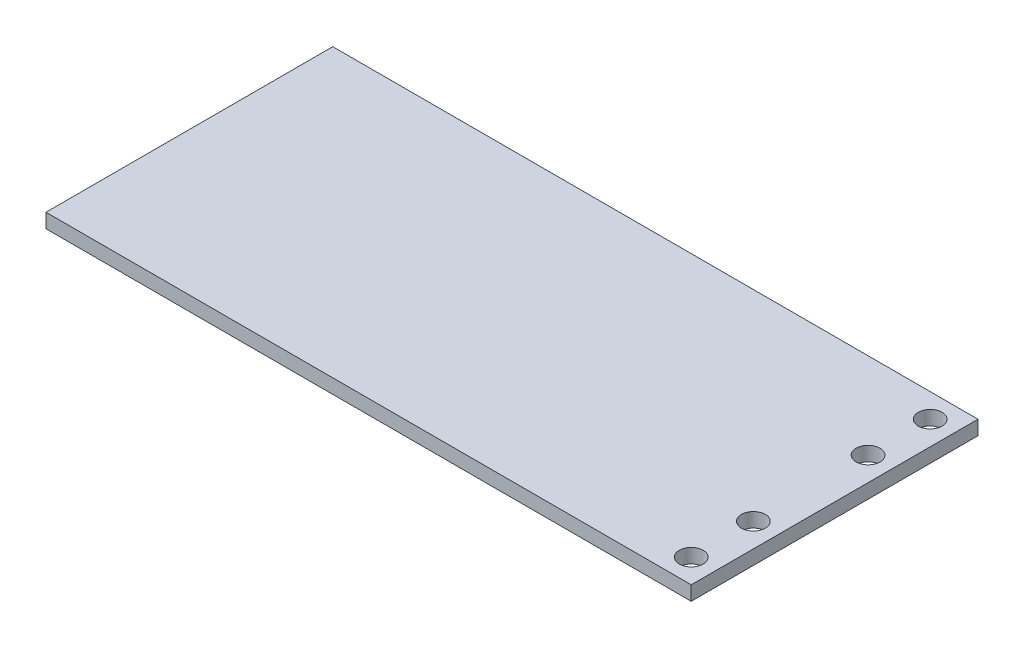
ISO-10303-21;
HEADER;
FILE_DESCRIPTION(('STEP AP214'),'2;1');
FILE_NAME('part.step','',(''),(''),'','','');
FILE_SCHEMA(('AUTOMOTIVE_DESIGN { 1 0 10303 214 1 1 1 1 }'));
ENDSEC;
DATA;
#1=APPLICATION_CONTEXT('core data for automotive mechanical design processes');
#2=APPLICATION_PROTOCOL_DEFINITION('international standard','automotive_design',2000,#1);
#3=PRODUCT_CONTEXT('',#1,'mechanical');
#4=PRODUCT('Part','Part','',(#3));
#5=PRODUCT_RELATED_PRODUCT_CATEGORY('part','',(#4));
#6=PRODUCT_DEFINITION_FORMATION('','',#4);
#7=PRODUCT_DEFINITION_CONTEXT('part definition',#1,'design');
#8=PRODUCT_DEFINITION('design','',#6,#7);
#9=PRODUCT_DEFINITION_SHAPE('','',#8);
#10=(LENGTH_UNIT() NAMED_UNIT(*) SI_UNIT(.MILLI.,.METRE.));
#11=(NAMED_UNIT(*) PLANE_ANGLE_UNIT() SI_UNIT($,.RADIAN.));
#12=(NAMED_UNIT(*) SI_UNIT($,.STERADIAN.) SOLID_ANGLE_UNIT());
#13=UNCERTAINTY_MEASURE_WITH_UNIT(LENGTH_MEASURE(1.E-05),#10,'distance_accuracy_value','');
#14=(GEOMETRIC_REPRESENTATION_CONTEXT(3) GLOBAL_UNCERTAINTY_ASSIGNED_CONTEXT((#13)) GLOBAL_UNIT_ASSIGNED_CONTEXT((#10,
#11,#12)) REPRESENTATION_CONTEXT('',''));
#15=CARTESIAN_POINT('',(0.,0.,0.));
#16=DIRECTION('',(0.,0.,1.));
#17=DIRECTION('',(1.,0.,0.));
#18=AXIS2_PLACEMENT_3D('',#15,#16,#17);
#19=CARTESIAN_POINT('',(0.,3.,0.));
#20=DIRECTION('',(0.,0.,-1.));
#21=DIRECTION('',(-1.,0.,0.));
#22=AXIS2_PLACEMENT_3D('',#19,#20,#21);
#23=PLANE('',#22);
#24=DIRECTION('',(1.,0.,0.));
#25=VECTOR('',#24,1.);
#26=CARTESIAN_POINT('',(0.,0.,0.));
#27=LINE('',#26,#25);
#28=CARTESIAN_POINT('',(0.,0.,0.));
#29=VERTEX_POINT('',#28);
#30=CARTESIAN_POINT('',(135.,0.,0.));
#31=VERTEX_POINT('',#30);
#32=EDGE_CURVE('E130',#29,#31,#27,.T.);
#33=ORIENTED_EDGE('',*,*,#32,.T.);
#34=DIRECTION('',(0.,-1.,0.));
#35=VECTOR('',#34,1.);
#36=CARTESIAN_POINT('',(135.,3.,0.));
#37=LINE('',#36,#35);
#38=CARTESIAN_POINT('',(135.,3.,0.));
#39=VERTEX_POINT('',#38);
#40=EDGE_CURVE('E11',#39,#31,#37,.T.);
#41=ORIENTED_EDGE('',*,*,#40,.F.);
#42=DIRECTION('',(1.,0.,0.));
#43=VECTOR('',#42,1.);
#44=CARTESIAN_POINT('',(0.,3.,0.));
#45=LINE('',#44,#43);
#46=CARTESIAN_POINT('',(0.,3.,0.));
#47=VERTEX_POINT('',#46);
#48=EDGE_CURVE('E96',#47,#39,#45,.T.);
#49=ORIENTED_EDGE('',*,*,#48,.F.);
#50=DIRECTION('',(0.,-1.,0.));
#51=VECTOR('',#50,1.);
#52=CARTESIAN_POINT('',(0.,3.,0.));
#53=LINE('',#52,#51);
#54=EDGE_CURVE('E62',#47,#29,#53,.T.);
#55=ORIENTED_EDGE('',*,*,#54,.T.);
#56=EDGE_LOOP('',(#33,#41,#49,#55));
#57=FACE_BOUND('',#56,.T.);
#58=ADVANCED_FACE('F44',(#57),#23,.F.);
#59=CARTESIAN_POINT('',(135.,3.,0.));
#60=DIRECTION('',(-1.,0.,0.));
#61=DIRECTION('',(0.,0.,1.));
#62=AXIS2_PLACEMENT_3D('',#59,#60,#61);
#63=PLANE('',#62);
#64=DIRECTION('',(0.,0.,-1.));
#65=VECTOR('',#64,1.);
#66=CARTESIAN_POINT('',(135.,0.,0.));
#67=LINE('',#66,#65);
#68=CARTESIAN_POINT('',(135.,0.,-60.));
#69=VERTEX_POINT('',#68);
#70=EDGE_CURVE('E102',#31,#69,#67,.T.);
#71=ORIENTED_EDGE('',*,*,#70,.T.);
#72=DIRECTION('',(0.,-1.,0.));
#73=VECTOR('',#72,1.);
#74=CARTESIAN_POINT('',(135.,3.,-60.));
#75=LINE('',#74,#73);
#76=CARTESIAN_POINT('',(135.,3.,-60.));
#77=VERTEX_POINT('',#76);
#78=EDGE_CURVE('E54',#77,#69,#75,.T.);
#79=ORIENTED_EDGE('',*,*,#78,.F.);
#80=DIRECTION('',(0.,0.,-1.));
#81=VECTOR('',#80,1.);
#82=CARTESIAN_POINT('',(135.,3.,0.));
#83=LINE('',#82,#81);
#84=EDGE_CURVE('E87',#39,#77,#83,.T.);
#85=ORIENTED_EDGE('',*,*,#84,.F.);
#86=ORIENTED_EDGE('',*,*,#40,.T.);
#87=EDGE_LOOP('',(#71,#79,#85,#86));
#88=FACE_BOUND('',#87,.T.);
#89=ADVANCED_FACE('F101',(#88),#63,.F.);
#90=CARTESIAN_POINT('',(0.,3.,-60.));
#91=DIRECTION('',(0.,0.,-1.));
#92=DIRECTION('',(-1.,0.,0.));
#93=AXIS2_PLACEMENT_3D('',#90,#91,#92);
#94=PLANE('',#93);
#95=DIRECTION('',(1.,0.,0.));
#96=VECTOR('',#95,1.);
#97=CARTESIAN_POINT('',(0.,0.,-60.));
#98=LINE('',#97,#96);
#99=CARTESIAN_POINT('',(0.,0.,-60.));
#100=VERTEX_POINT('',#99);
#101=EDGE_CURVE('E135',#100,#69,#98,.T.);
#102=ORIENTED_EDGE('',*,*,#101,.F.);
#103=DIRECTION('',(0.,-1.,0.));
#104=VECTOR('',#103,1.);
#105=CARTESIAN_POINT('',(0.,3.,-60.));
#106=LINE('',#105,#104);
#107=CARTESIAN_POINT('',(0.,3.,-60.));
#108=VERTEX_POINT('',#107);
#109=EDGE_CURVE('E76',#108,#100,#106,.T.);
#110=ORIENTED_EDGE('',*,*,#109,.F.);
#111=DIRECTION('',(1.,0.,0.));
#112=VECTOR('',#111,1.);
#113=CARTESIAN_POINT('',(0.,3.,-60.));
#114=LINE('',#113,#112);
#115=EDGE_CURVE('E95',#108,#77,#114,.T.);
#116=ORIENTED_EDGE('',*,*,#115,.T.);
#117=ORIENTED_EDGE('',*,*,#78,.T.);
#118=EDGE_LOOP('',(#102,#110,#116,#117));
#119=FACE_BOUND('',#118,.T.);
#120=ADVANCED_FACE('F106',(#119),#94,.T.);
#121=CARTESIAN_POINT('',(130.,3.,-18.));
#122=DIRECTION('',(0.,-1.,0.));
#123=DIRECTION('',(0.,0.,-1.));
#124=AXIS2_PLACEMENT_3D('',#121,#122,#123);
#125=CYLINDRICAL_SURFACE('',#124,2.5);
#126=CARTESIAN_POINT('',(130.,3.,-18.));
#127=DIRECTION('',(0.,1.,0.));
#128=DIRECTION('',(0.,0.,1.));
#129=AXIS2_PLACEMENT_3D('',#126,#127,#128);
#130=CIRCLE('',#129,2.5);
#131=CARTESIAN_POINT('',(130.,3.,-15.5));
#132=VERTEX_POINT('',#131);
#133=EDGE_CURVE('E118',#132,#132,#130,.T.);
#134=ORIENTED_EDGE('',*,*,#133,.T.);
#135=EDGE_LOOP('',(#134));
#136=FACE_BOUND('',#135,.T.);
#137=CARTESIAN_POINT('',(130.,0.,-18.));
#138=DIRECTION('',(0.,1.,0.));
#139=DIRECTION('',(0.,0.,1.));
#140=AXIS2_PLACEMENT_3D('',#137,#138,#139);
#141=CIRCLE('',#140,2.5);
#142=CARTESIAN_POINT('',(130.,0.,-15.5));
#143=VERTEX_POINT('',#142);
#144=EDGE_CURVE('E146',#143,#143,#141,.T.);
#145=ORIENTED_EDGE('',*,*,#144,.F.);
#146=EDGE_LOOP('',(#145));
#147=FACE_BOUND('',#146,.T.);
#148=ADVANCED_FACE('F188',(#136,#147),#125,.F.);
#149=CARTESIAN_POINT('',(130.,3.,-5.));
#150=DIRECTION('',(0.,-1.,0.));
#151=DIRECTION('',(0.,0.,-1.));
#152=AXIS2_PLACEMENT_3D('',#149,#150,#151);
#153=CYLINDRICAL_SURFACE('',#152,2.5);
#154=CARTESIAN_POINT('',(130.,3.,-5.));
#155=DIRECTION('',(0.,1.,0.));
#156=DIRECTION('',(0.,0.,1.));
#157=AXIS2_PLACEMENT_3D('',#154,#155,#156);
#158=CIRCLE('',#157,2.5);
#159=CARTESIAN_POINT('',(130.,3.,-2.5));
#160=VERTEX_POINT('',#159);
#161=EDGE_CURVE('E111',#160,#160,#158,.T.);
#162=ORIENTED_EDGE('',*,*,#161,.T.);
#163=EDGE_LOOP('',(#162));
#164=FACE_BOUND('',#163,.T.);
#165=CARTESIAN_POINT('',(130.,0.,-5.));
#166=DIRECTION('',(0.,1.,0.));
#167=DIRECTION('',(0.,0.,1.));
#168=AXIS2_PLACEMENT_3D('',#165,#166,#167);
#169=CIRCLE('',#168,2.5);
#170=CARTESIAN_POINT('',(130.,0.,-2.5));
#171=VERTEX_POINT('',#170);
#172=EDGE_CURVE('E142',#171,#171,#169,.T.);
#173=ORIENTED_EDGE('',*,*,#172,.F.);
#174=EDGE_LOOP('',(#173));
#175=FACE_BOUND('',#174,.T.);
#176=ADVANCED_FACE('F192',(#164,#175),#153,.F.);
#177=CARTESIAN_POINT('',(0.,3.,0.));
#178=DIRECTION('',(-1.,0.,0.));
#179=DIRECTION('',(0.,0.,1.));
#180=AXIS2_PLACEMENT_3D('',#177,#178,#179);
#181=PLANE('',#180);
#182=DIRECTION('',(0.,0.,-1.));
#183=VECTOR('',#182,1.);
#184=CARTESIAN_POINT('',(0.,0.,0.));
#185=LINE('',#184,#183);
#186=EDGE_CURVE('E138',#29,#100,#185,.T.);
#187=ORIENTED_EDGE('',*,*,#186,.F.);
#188=ORIENTED_EDGE('',*,*,#54,.F.);
#189=DIRECTION('',(0.,0.,-1.));
#190=VECTOR('',#189,1.);
#191=CARTESIAN_POINT('',(0.,3.,0.));
#192=LINE('',#191,#190);
#193=EDGE_CURVE('E108',#47,#108,#192,.T.);
#194=ORIENTED_EDGE('',*,*,#193,.T.);
#195=ORIENTED_EDGE('',*,*,#109,.T.);
#196=EDGE_LOOP('',(#187,#188,#194,#195));
#197=FACE_BOUND('',#196,.T.);
#198=ADVANCED_FACE('F189',(#197),#181,.T.);
#199=CARTESIAN_POINT('',(130.,3.,-55.));
#200=DIRECTION('',(0.,-1.,0.));
#201=DIRECTION('',(0.,0.,-1.));
#202=AXIS2_PLACEMENT_3D('',#199,#200,#201);
#203=CYLINDRICAL_SURFACE('',#202,2.5);
#204=CARTESIAN_POINT('',(130.,3.,-55.));
#205=DIRECTION('',(0.,1.,0.));
#206=DIRECTION('',(0.,0.,1.));
#207=AXIS2_PLACEMENT_3D('',#204,#205,#206);
#208=CIRCLE('',#207,2.5);
#209=CARTESIAN_POINT('',(130.,3.,-52.5));
#210=VERTEX_POINT('',#209);
#211=EDGE_CURVE('E154',#210,#210,#208,.T.);
#212=ORIENTED_EDGE('',*,*,#211,.T.);
#213=EDGE_LOOP('',(#212));
#214=FACE_BOUND('',#213,.T.);
#215=CARTESIAN_POINT('',(130.,0.,-55.));
#216=DIRECTION('',(0.,1.,0.));
#217=DIRECTION('',(0.,0.,1.));
#218=AXIS2_PLACEMENT_3D('',#215,#216,#217);
#219=CIRCLE('',#218,2.5);
#220=CARTESIAN_POINT('',(130.,0.,-52.5));
#221=VERTEX_POINT('',#220);
#222=EDGE_CURVE('E126',#221,#221,#219,.T.);
#223=ORIENTED_EDGE('',*,*,#222,.F.);
#224=EDGE_LOOP('',(#223));
#225=FACE_BOUND('',#224,.T.);
#226=ADVANCED_FACE('F46',(#214,#225),#203,.F.);
#227=CARTESIAN_POINT('',(130.,3.,-42.));
#228=DIRECTION('',(0.,-1.,0.));
#229=DIRECTION('',(0.,0.,-1.));
#230=AXIS2_PLACEMENT_3D('',#227,#228,#229);
#231=CYLINDRICAL_SURFACE('',#230,2.5);
#232=CARTESIAN_POINT('',(130.,3.,-42.));
#233=DIRECTION('',(0.,1.,0.));
#234=DIRECTION('',(0.,0.,1.));
#235=AXIS2_PLACEMENT_3D('',#232,#233,#234);
#236=CIRCLE('',#235,2.5);
#237=CARTESIAN_POINT('',(130.,3.,-39.5));
#238=VERTEX_POINT('',#237);
#239=EDGE_CURVE('E122',#238,#238,#236,.T.);
#240=ORIENTED_EDGE('',*,*,#239,.T.);
#241=EDGE_LOOP('',(#240));
#242=FACE_BOUND('',#241,.T.);
#243=CARTESIAN_POINT('',(130.,0.,-42.));
#244=DIRECTION('',(0.,1.,0.));
#245=DIRECTION('',(0.,0.,1.));
#246=AXIS2_PLACEMENT_3D('',#243,#244,#245);
#247=CIRCLE('',#246,2.5);
#248=CARTESIAN_POINT('',(130.,0.,-39.5));
#249=VERTEX_POINT('',#248);
#250=EDGE_CURVE('E150',#249,#249,#247,.T.);
#251=ORIENTED_EDGE('',*,*,#250,.F.);
#252=EDGE_LOOP('',(#251));
#253=FACE_BOUND('',#252,.T.);
#254=ADVANCED_FACE('F170',(#242,#253),#231,.F.);
#255=CARTESIAN_POINT('',(0.,3.,0.));
#256=DIRECTION('',(0.,1.,0.));
#257=DIRECTION('',(0.,0.,1.));
#258=AXIS2_PLACEMENT_3D('',#255,#256,#257);
#259=PLANE('',#258);
#260=ORIENTED_EDGE('',*,*,#211,.F.);
#261=EDGE_LOOP('',(#260));
#262=FACE_BOUND('',#261,.T.);
#263=ORIENTED_EDGE('',*,*,#48,.T.);
#264=ORIENTED_EDGE('',*,*,#84,.T.);
#265=ORIENTED_EDGE('',*,*,#115,.F.);
#266=ORIENTED_EDGE('',*,*,#193,.F.);
#267=EDGE_LOOP('',(#263,#264,#265,#266));
#268=FACE_BOUND('',#267,.T.);
#269=ORIENTED_EDGE('',*,*,#161,.F.);
#270=EDGE_LOOP('',(#269));
#271=FACE_BOUND('',#270,.T.);
#272=ORIENTED_EDGE('',*,*,#133,.F.);
#273=EDGE_LOOP('',(#272));
#274=FACE_BOUND('',#273,.T.);
#275=ORIENTED_EDGE('',*,*,#239,.F.);
#276=EDGE_LOOP('',(#275));
#277=FACE_BOUND('',#276,.T.);
#278=ADVANCED_FACE('F91',(#262,#268,#271,#274,#277),#259,.T.);
#279=CARTESIAN_POINT('',(0.,0.,0.));
#280=DIRECTION('',(0.,1.,0.));
#281=DIRECTION('',(0.,0.,1.));
#282=AXIS2_PLACEMENT_3D('',#279,#280,#281);
#283=PLANE('',#282);
#284=ORIENTED_EDGE('',*,*,#222,.T.);
#285=EDGE_LOOP('',(#284));
#286=FACE_BOUND('',#285,.T.);
#287=ORIENTED_EDGE('',*,*,#32,.F.);
#288=ORIENTED_EDGE('',*,*,#186,.T.);
#289=ORIENTED_EDGE('',*,*,#101,.T.);
#290=ORIENTED_EDGE('',*,*,#70,.F.);
#291=EDGE_LOOP('',(#287,#288,#289,#290));
#292=FACE_BOUND('',#291,.T.);
#293=ORIENTED_EDGE('',*,*,#172,.T.);
#294=EDGE_LOOP('',(#293));
#295=FACE_BOUND('',#294,.T.);
#296=ORIENTED_EDGE('',*,*,#144,.T.);
#297=EDGE_LOOP('',(#296));
#298=FACE_BOUND('',#297,.T.);
#299=ORIENTED_EDGE('',*,*,#250,.T.);
#300=EDGE_LOOP('',(#299));
#301=FACE_BOUND('',#300,.T.);
#302=ADVANCED_FACE('F169',(#286,#292,#295,#298,#301),#283,.F.);
#303=CLOSED_SHELL('',(#58,#89,#120,#148,#176,#198,#226,#254,#278,#302));
#304=MANIFOLD_SOLID_BREP('B2',#303);
#305=ADVANCED_BREP_SHAPE_REPRESENTATION('',(#18,#304),#14);
#306=SHAPE_DEFINITION_REPRESENTATION(#9,#305);
ENDSEC;
END-ISO-10303-21;
